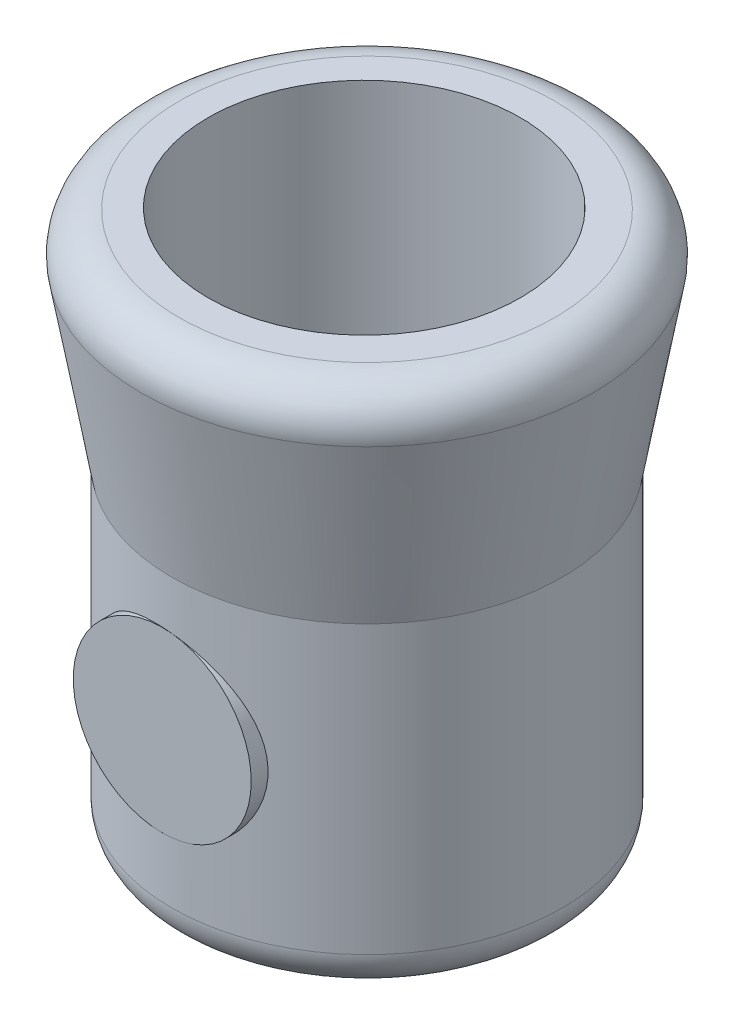
ISO-10303-21;
HEADER;
FILE_DESCRIPTION(('STEP AP214'),'2;1');
FILE_NAME('part.step','',(''),(''),'','','');
FILE_SCHEMA(('AUTOMOTIVE_DESIGN { 1 0 10303 214 1 1 1 1 }'));
ENDSEC;
DATA;
#1=APPLICATION_CONTEXT('core data for automotive mechanical design processes');
#2=APPLICATION_PROTOCOL_DEFINITION('international standard','automotive_design',2000,#1);
#3=PRODUCT_CONTEXT('',#1,'mechanical');
#4=PRODUCT('Part','Part','',(#3));
#5=PRODUCT_RELATED_PRODUCT_CATEGORY('part','',(#4));
#6=PRODUCT_DEFINITION_FORMATION('','',#4);
#7=PRODUCT_DEFINITION_CONTEXT('part definition',#1,'design');
#8=PRODUCT_DEFINITION('design','',#6,#7);
#9=PRODUCT_DEFINITION_SHAPE('','',#8);
#10=(LENGTH_UNIT() NAMED_UNIT(*) SI_UNIT(.MILLI.,.METRE.));
#11=(NAMED_UNIT(*) PLANE_ANGLE_UNIT() SI_UNIT($,.RADIAN.));
#12=(NAMED_UNIT(*) SI_UNIT($,.STERADIAN.) SOLID_ANGLE_UNIT());
#13=UNCERTAINTY_MEASURE_WITH_UNIT(LENGTH_MEASURE(1.E-05),#10,'distance_accuracy_value','');
#14=(GEOMETRIC_REPRESENTATION_CONTEXT(3) GLOBAL_UNCERTAINTY_ASSIGNED_CONTEXT((#13)) GLOBAL_UNIT_ASSIGNED_CONTEXT((#10,
#11,#12)) REPRESENTATION_CONTEXT('',''));
#15=CARTESIAN_POINT('',(0.,0.,0.));
#16=DIRECTION('',(0.,0.,1.));
#17=DIRECTION('',(1.,0.,0.));
#18=AXIS2_PLACEMENT_3D('',#15,#16,#17);
#19=CARTESIAN_POINT('',(30.,-70.,0.));
#20=DIRECTION('',(0.,-1.,0.));
#21=DIRECTION('',(0.,0.,-1.));
#22=AXIS2_PLACEMENT_3D('',#19,#20,#21);
#23=CYLINDRICAL_SURFACE('',#22,25.);
#24=CARTESIAN_POINT('',(30.,-65.,0.));
#25=DIRECTION('',(0.,-1.,0.));
#26=DIRECTION('',(0.,0.,-1.));
#27=AXIS2_PLACEMENT_3D('',#24,#25,#26);
#28=CIRCLE('',#27,25.);
#29=CARTESIAN_POINT('',(30.,-65.,-25.));
#30=VERTEX_POINT('',#29);
#31=EDGE_CURVE('E77',#30,#30,#28,.T.);
#32=ORIENTED_EDGE('',*,*,#31,.F.);
#33=EDGE_LOOP('',(#32));
#34=FACE_BOUND('',#33,.T.);
#35=CARTESIAN_POINT('',(30.,-28.3216783216779,0.));
#36=DIRECTION('',(0.,-1.,0.));
#37=DIRECTION('',(0.,0.,-1.));
#38=AXIS2_PLACEMENT_3D('',#35,#36,#37);
#39=CIRCLE('',#38,25.);
#40=CARTESIAN_POINT('',(30.,-28.3216783216779,-25.));
#41=VERTEX_POINT('',#40);
#42=EDGE_CURVE('E65',#41,#41,#39,.T.);
#43=ORIENTED_EDGE('',*,*,#42,.T.);
#44=EDGE_LOOP('',(#43));
#45=FACE_BOUND('',#44,.T.);
#46=CARTESIAN_POINT('',(30.,-57.2082714240676,25.));
#47=CARTESIAN_POINT('',(30.3039931747391,-57.1753347401536,24.9999980915506));
#48=CARTESIAN_POINT('',(30.6067343740086,-57.1301450727298,24.994440799908));
#49=CARTESIAN_POINT('',(31.2073587046698,-57.0156346864035,24.9726390266976));
#50=CARTESIAN_POINT('',(31.5052389175544,-56.9462999913821,24.9563883505092));
#51=CARTESIAN_POINT('',(32.094433406971,-56.78398062961,24.9138669076109));
#52=CARTESIAN_POINT('',(32.3857324536601,-56.6909462222746,24.8875750078757));
#53=CARTESIAN_POINT('',(32.9590879127817,-56.4821506928867,24.8259331690467));
#54=CARTESIAN_POINT('',(33.2411435988607,-56.3663877897773,24.7905825200223));
#55=CARTESIAN_POINT('',(33.7930791248408,-56.1136453907066,24.7121417666826));
#56=CARTESIAN_POINT('',(34.0630026593612,-55.9767515082594,24.6690827854199));
#57=CARTESIAN_POINT('',(34.5902732908694,-55.6824951690911,24.5764329021064));
#58=CARTESIAN_POINT('',(34.8476200079001,-55.5251320945023,24.5268418028816));
#59=CARTESIAN_POINT('',(35.3482130548631,-55.1911426895198,24.422570739774));
#60=CARTESIAN_POINT('',(35.5914659288213,-55.0145254107705,24.3678931688639));
#61=CARTESIAN_POINT('',(36.0628453361051,-54.6430370091775,24.2549104211854));
#62=CARTESIAN_POINT('',(36.2909662880447,-54.4481592142113,24.1966039210933));
#63=CARTESIAN_POINT('',(36.7424361080656,-54.0306302590207,24.074822053051));
#64=CARTESIAN_POINT('',(36.9649035421215,-53.8070575854434,24.0112360981742));
#65=CARTESIAN_POINT('',(37.390510954279,-53.3423175709296,23.8836704644446));
#66=CARTESIAN_POINT('',(37.5936504735084,-53.1011498125009,23.8196907762823));
#67=CARTESIAN_POINT('',(37.9795555068573,-52.6024037280023,23.6932049001939));
#68=CARTESIAN_POINT('',(38.1623079716916,-52.3448150551442,23.6306996759906));
#69=CARTESIAN_POINT('',(38.5060558849408,-51.814903241479,23.5091523214623));
#70=CARTESIAN_POINT('',(38.6670613952543,-51.542586997077,23.4501085967743));
#71=CARTESIAN_POINT('',(38.9713908454263,-50.9750934288494,23.3354130254141));
#72=CARTESIAN_POINT('',(39.1139226882085,-50.6794529058041,23.2799459997751));
#73=CARTESIAN_POINT('',(39.3733022918205,-50.0759551893137,23.1767274987231));
#74=CARTESIAN_POINT('',(39.490161391162,-49.7681034602264,23.1289726196758));
#75=CARTESIAN_POINT('',(39.6970688783428,-49.1423362338871,23.0429906759572));
#76=CARTESIAN_POINT('',(39.7871273340302,-48.8244245654991,23.0047600343212));
#77=CARTESIAN_POINT('',(39.9394637443664,-48.1809023654681,22.9393538916176));
#78=CARTESIAN_POINT('',(40.0017441271268,-47.855292509353,22.9121774243109));
#79=CARTESIAN_POINT('',(40.0945830693991,-47.2207927679872,22.8714184009345));
#80=CARTESIAN_POINT('',(40.126964950997,-46.9122188114786,22.85705661222));
#81=CARTESIAN_POINT('',(40.1664525498288,-46.2931435925758,22.8395210074064));
#82=CARTESIAN_POINT('',(40.1735593904048,-45.9826424164508,22.8363466940832));
#83=CARTESIAN_POINT('',(40.1624141242109,-45.3622501831445,22.8413084691835));
#84=CARTESIAN_POINT('',(40.1441668901026,-45.052359020189,22.8494423843405));
#85=CARTESIAN_POINT('',(40.0825388785543,-44.435582169358,22.876703022494));
#86=CARTESIAN_POINT('',(40.0391585098925,-44.1286964326831,22.8958295667007));
#87=CARTESIAN_POINT('',(39.9307106409369,-43.5363738320261,22.9430659153062));
#88=CARTESIAN_POINT('',(39.8669114510716,-43.2506609743966,22.9706471216081));
#89=CARTESIAN_POINT('',(39.7177954887776,-42.6857534155041,23.0341271316702));
#90=CARTESIAN_POINT('',(39.6324712952293,-42.4065609986217,23.0700288037078));
#91=CARTESIAN_POINT('',(39.4410523247752,-41.856451938195,23.1490224295194));
#92=CARTESIAN_POINT('',(39.3349576033423,-41.5855352725505,23.1921143640899));
#93=CARTESIAN_POINT('',(39.1028076799521,-41.0534283380378,23.2842109141497));
#94=CARTESIAN_POINT('',(38.9767510688279,-40.7922387574413,23.3332159470032));
#95=CARTESIAN_POINT('',(38.6982421632917,-40.2671581111182,23.4385134861796));
#96=CARTESIAN_POINT('',(38.5447352953291,-40.0038764158118,23.495056114184));
#97=CARTESIAN_POINT('',(38.2175302270084,-39.4909600128772,23.6114875348666));
#98=CARTESIAN_POINT('',(38.0438315058777,-39.2413256574748,23.671376413828));
#99=CARTESIAN_POINT('',(37.6772065093999,-38.7568906492857,23.7928097030807));
#100=CARTESIAN_POINT('',(37.4842736828425,-38.5220950954496,23.8543546721958));
#101=CARTESIAN_POINT('',(37.0802500782394,-38.0686133209701,23.9773779706211));
#102=CARTESIAN_POINT('',(36.8691568378452,-37.8499292923549,24.0388562897463));
#103=CARTESIAN_POINT('',(36.4144981062061,-37.4151486270408,24.1643050590765));
#104=CARTESIAN_POINT('',(36.1696936032888,-37.200308226947,24.2281480574557));
#105=CARTESIAN_POINT('',(35.6620613531019,-36.7919955839995,24.3517816941459));
#106=CARTESIAN_POINT('',(35.3992402635354,-36.5985155160835,24.4115738133185));
#107=CARTESIAN_POINT('',(34.8570354043864,-36.2342617994286,24.5252099942349));
#108=CARTESIAN_POINT('',(34.5776499841913,-36.0634904190961,24.5790534616679));
#109=CARTESIAN_POINT('',(34.0041404540026,-35.746123066004,24.6789699749004));
#110=CARTESIAN_POINT('',(33.7100170569708,-35.599525925265,24.7250433961124));
#111=CARTESIAN_POINT('',(33.1164476087592,-35.335156223562,24.8067588699927));
#112=CARTESIAN_POINT('',(32.8173086104501,-35.2167653453764,24.842628877147));
#113=CARTESIAN_POINT('',(32.2091257822793,-35.005444418165,24.9040791274669));
#114=CARTESIAN_POINT('',(31.9000820421167,-34.9125141386362,24.9296594637891));
#115=CARTESIAN_POINT('',(31.2746878816709,-34.753118122692,24.9694471010009));
#116=CARTESIAN_POINT('',(30.9583413350168,-34.6866386823718,24.9836602949543));
#117=CARTESIAN_POINT('',(30.3208446091971,-34.5807716993697,24.9999738598825));
#118=CARTESIAN_POINT('',(29.9996947654011,-34.541382274182,25.0020750726031));
#119=CARTESIAN_POINT('',(29.3800011833595,-34.4920101134423,24.9940830035242));
#120=CARTESIAN_POINT('',(29.0816040762496,-34.4800113296219,24.9849087568333));
#121=CARTESIAN_POINT('',(28.4853220289971,-34.4794334586249,24.9558576712503));
#122=CARTESIAN_POINT('',(28.1874370603293,-34.4908530218094,24.9359814491798));
#123=CARTESIAN_POINT('',(27.5943735697505,-34.5368587340619,24.8857696084367));
#124=CARTESIAN_POINT('',(27.2991949225943,-34.5714438055163,24.8554344763236));
#125=CARTESIAN_POINT('',(26.713600666865,-34.6632887374214,24.7848050813848));
#126=CARTESIAN_POINT('',(26.4231851312805,-34.7205489450019,24.7445106660976));
#127=CARTESIAN_POINT('',(25.8527024807172,-34.8561818401138,24.6552676854836));
#128=CARTESIAN_POINT('',(25.572550632621,-34.9342760241926,24.6064360156361));
#129=CARTESIAN_POINT('',(25.0204220213756,-35.1110829498773,24.5006697483099));
#130=CARTESIAN_POINT('',(24.7484451141367,-35.2097953278276,24.4437352937505));
#131=CARTESIAN_POINT('',(24.2141219165892,-35.4269450969569,24.3228011166232));
#132=CARTESIAN_POINT('',(23.9517756204931,-35.5453824762821,24.2588013983012));
#133=CARTESIAN_POINT('',(23.4378926923141,-35.8010914715344,24.1248687266473));
#134=CARTESIAN_POINT('',(23.1863602268392,-35.9383702632122,24.0549335166752));
#135=CARTESIAN_POINT('',(22.6770931494804,-36.2416438008211,23.9050332156802));
#136=CARTESIAN_POINT('',(22.4202824263988,-36.4090132593268,23.8247089371128));
#137=CARTESIAN_POINT('',(21.9216377639779,-36.7633046484117,23.6602838153705));
#138=CARTESIAN_POINT('',(21.6798106833593,-36.9502354293873,23.5761812726504));
#139=CARTESIAN_POINT('',(21.2122422687664,-37.3425895884394,23.4059232762909));
#140=CARTESIAN_POINT('',(20.9865078711639,-37.5480208554012,23.3197669585154));
#141=CARTESIAN_POINT('',(20.5522651097441,-37.9762695546814,23.1472438873671));
#142=CARTESIAN_POINT('',(20.343757282813,-38.1990875284564,23.060877127522));
#143=CARTESIAN_POINT('',(19.9286107809012,-38.6800708785589,22.8827933230597));
#144=CARTESIAN_POINT('',(19.7235293090968,-38.9396364494169,22.7912187560061));
#145=CARTESIAN_POINT('',(19.3360224593805,-39.4766833630245,22.6124994603795));
#146=CARTESIAN_POINT('',(19.1536012303308,-39.7541679724761,22.5253555447343));
#147=CARTESIAN_POINT('',(18.8128499657802,-40.3256139243829,22.3580793406246));
#148=CARTESIAN_POINT('',(18.6545213822744,-40.6195762584439,22.27794747488));
#149=CARTESIAN_POINT('',(18.3635414909454,-41.2221473326505,22.1273513744792));
#150=CARTESIAN_POINT('',(18.2308761266102,-41.5307479389707,22.0568818536629));
#151=CARTESIAN_POINT('',(17.9966432424786,-42.1501530224066,21.9302660867569));
#152=CARTESIAN_POINT('',(17.894182257869,-42.4605367545607,21.8737188486481));
#153=CARTESIAN_POINT('',(17.7159000293276,-43.0910023936261,21.7740979806972));
#154=CARTESIAN_POINT('',(17.6400782534469,-43.4110841067433,21.7310240818127));
#155=CARTESIAN_POINT('',(17.5162881190676,-44.0578797926339,21.6601486166104));
#156=CARTESIAN_POINT('',(17.4682872121724,-44.3845855505153,21.632329205713));
#157=CARTESIAN_POINT('',(17.4008144481347,-45.0418937467452,21.593102529719));
#158=CARTESIAN_POINT('',(17.3813385593792,-45.3724956277714,21.5816929453266));
#159=CARTESIAN_POINT('',(17.3718953815444,-45.9914811672551,21.5761663361083));
#160=CARTESIAN_POINT('',(17.3784405559974,-46.2798005734545,21.5800054928419));
#161=CARTESIAN_POINT('',(17.4133115153794,-46.8546464530338,21.6003631528056));
#162=CARTESIAN_POINT('',(17.4416351723238,-47.1411730988276,21.6168804172521));
#163=CARTESIAN_POINT('',(17.5196943533812,-47.7103564753856,21.6620403280206));
#164=CARTESIAN_POINT('',(17.5694332065846,-47.9930125974072,21.6906848595702));
#165=CARTESIAN_POINT('',(17.6897101128704,-48.5524717933608,21.7591714200877));
#166=CARTESIAN_POINT('',(17.7602488166585,-48.829274683889,21.7990137993688));
#167=CARTESIAN_POINT('',(17.9196250702762,-49.3694768128331,21.8877287009799));
#168=CARTESIAN_POINT('',(18.0080389157433,-49.6330361105025,21.9363898301547));
#169=CARTESIAN_POINT('',(18.2032297704104,-50.1516015290021,22.0419714680299));
#170=CARTESIAN_POINT('',(18.3100130718387,-50.4066046831454,22.0988948057995));
#171=CARTESIAN_POINT('',(18.6566124475927,-51.1568844921801,22.279937277432));
#172=CARTESIAN_POINT('',(18.9227703503893,-51.6377409613702,22.4143823758217));
#173=CARTESIAN_POINT('',(19.5536582784713,-52.6068402713765,22.715843186734));
#174=CARTESIAN_POINT('',(19.9262908721567,-53.0893268598283,22.8848296254905));
#175=CARTESIAN_POINT('',(20.5381201945218,-53.7632369456546,23.1413487500203));
#176=CARTESIAN_POINT('',(20.7510233206421,-53.9796876033014,23.227415342643));
#177=CARTESIAN_POINT('',(21.1936564478945,-54.3951392024021,23.3988155936098));
#178=CARTESIAN_POINT('',(21.4233888386022,-54.5941376569816,23.4841491459407));
#179=CARTESIAN_POINT('',(21.9202605792358,-54.9908582019017,23.6599545570955));
#180=CARTESIAN_POINT('',(22.1889007678114,-55.1868096449018,23.7501855266009));
#181=CARTESIAN_POINT('',(22.7433704508639,-55.5551098729456,23.9254219619079));
#182=CARTESIAN_POINT('',(23.0291934486757,-55.7274674988259,24.0104293784099));
#183=CARTESIAN_POINT('',(23.6166305482121,-56.0472684282405,24.1732398824356));
#184=CARTESIAN_POINT('',(23.9182525736305,-56.1946990703548,24.2510392997112));
#185=CARTESIAN_POINT('',(24.5352071645607,-56.4630221950302,24.3974694954286));
#186=CARTESIAN_POINT('',(24.8505381978348,-56.5839176343066,24.4661012950487));
#187=CARTESIAN_POINT('',(25.4796332796265,-56.7933971591236,24.5899339323617));
#188=CARTESIAN_POINT('',(25.7929416517309,-56.8830933541971,24.6455667792099));
#189=CARTESIAN_POINT('',(26.4278665122732,-57.0356041076418,24.7455677934203));
#190=CARTESIAN_POINT('',(26.7494841168775,-57.0984150344387,24.7899344386518));
#191=CARTESIAN_POINT('',(27.3974861506357,-57.1960739215723,24.866304279384));
#192=CARTESIAN_POINT('',(27.7238554369512,-57.230996617266,24.8983403981291));
#193=CARTESIAN_POINT('',(28.3792327431125,-57.2725186153905,24.9495690708364));
#194=CARTESIAN_POINT('',(28.7082388046399,-57.2791372813813,24.9687703978406));
#195=CARTESIAN_POINT('',(29.1978409439014,-57.2677699645232,24.9876469317721));
#196=CARTESIAN_POINT('',(29.3585766637843,-57.2606294782736,24.9922861119681));
#197=CARTESIAN_POINT('',(29.6796571844577,-57.2395477169657,24.9984630909637));
#198=CARTESIAN_POINT('',(29.840001999486,-57.2256066934345,25.0000010044571));
#199=CARTESIAN_POINT('',(30.,-57.2082714240676,25.));
#200=B_SPLINE_CURVE_WITH_KNOTS('',3,(#46,#47,#48,#49,#50,#51,#52,#53,#54,#55,#56,#57,#58,#59,
#60,#61,#62,#63,#64,#65,#66,#67,#68,#69,#70,#71,#72,#73,#74,#75,#76,#77,#78,#79,#80,#81,#82,#83,
#84,#85,#86,#87,#88,#89,#90,#91,#92,#93,#94,#95,#96,#97,#98,#99,#100,#101,#102,#103,#104,#105,
#106,#107,#108,#109,#110,#111,#112,#113,#114,#115,#116,#117,#118,#119,#120,#121,#122,#123,#124,
#125,#126,#127,#128,#129,#130,#131,#132,#133,#134,#135,#136,#137,#138,#139,#140,#141,#142,#143,
#144,#145,#146,#147,#148,#149,#150,#151,#152,#153,#154,#155,#156,#157,#158,#159,#160,#161,#162,
#163,#164,#165,#166,#167,#168,#169,#170,#171,#172,#173,#174,#175,#176,#177,#178,#179,#180,#181,
#182,#183,#184,#185,#186,#187,#188,#189,#190,#191,#192,#193,#194,#195,#196,#197,#198,#199),
.UNSPECIFIED.,.T.,.F.,(4,2,2,2,2,2,2,2,2,2,2,2,2,2,2,2,2,2,2,2,2,2,2,2,2,2,2,2,2,2,2,2,2,2,2,2,
2,2,2,2,2,2,2,2,2,2,2,2,2,2,2,2,2,2,2,2,2,2,2,2,2,2,2,2,2,2,2,2,2,2,2,2,2,2,2,2,4),(0.,
0.917153226558738,1.83483822337624,2.75446534369776,3.67416455688814,4.59023088414257,
5.50632486950684,6.42199002970338,7.33799107482571,8.30215041647162,9.26633264292401,
10.231128521475,11.1954764670817,12.1927738140852,13.1896298096359,14.1861108552222,
15.1825047802405,16.1130953591524,17.0436445777089,17.9740149838121,18.9043702583174,
19.7855215962438,20.6669771426005,21.5484303348449,22.4299457791497,23.3588420610598,
24.2877623056551,25.2170000320974,26.1463639519313,27.1408831287944,28.1350367598404,
29.1292896239695,30.1234944366536,31.0933361801017,32.0631691429692,33.032498989147,
34.0017614690462,34.8970016487337,35.792190235668,36.6873371830965,37.58249783471,
38.4662447529539,39.3499760853347,40.2337068866363,41.1177751955492,42.067419806536,
43.0174959512829,43.96797915858,44.918491977636,45.9469975960913,46.9756912468751,
48.004446869562,49.0326374065936,50.0263571344859,51.020057018019,52.0125919858757,
53.0049866592299,53.8691586946012,54.7332463020879,55.5974682844811,56.4617173061959,
57.3074792983979,58.1535315748001,59.8446643864999,61.7342701973617,62.6802324267582,
63.6263292339947,64.6586870330201,65.6906569322332,66.7231494460028,67.7555268546485,
68.746010492723,69.7366278799062,70.7245816006235,71.7118593269746,72.1945942101023,
72.677311239984),.UNSPECIFIED.);
#201=CARTESIAN_POINT('',(30.,-57.2082714240676,25.));
#202=VERTEX_POINT('',#201);
#203=CARTESIAN_POINT('',(30.,-34.5460218423109,25.));
#204=VERTEX_POINT('',#203);
#205=EDGE_CURVE('E11',#202,#204,#200,.T.);
#206=ORIENTED_EDGE('',*,*,#205,.F.);
#207=EDGE_CURVE('E43',#204,#202,#200,.T.);
#208=ORIENTED_EDGE('',*,*,#207,.F.);
#209=EDGE_LOOP('',(#206,#208));
#210=FACE_BOUND('',#209,.T.);
#211=ADVANCED_FACE('F39',(#34,#45,#210),#23,.T.);
#212=CARTESIAN_POINT('',(30.,-5.86927344658478,0.));
#213=DIRECTION('',(0.,1.,0.));
#214=DIRECTION('',(0.,0.,1.));
#215=AXIS2_PLACEMENT_3D('',#212,#213,#214);
#216=CONICAL_SURFACE('',#215,28.9638196260967,0.17474262650302);
#217=ORIENTED_EDGE('',*,*,#42,.F.);
#218=EDGE_LOOP('',(#217));
#219=FACE_BOUND('',#218,.T.);
#220=CARTESIAN_POINT('',(30.,-5.86927344658478,0.));
#221=DIRECTION('',(0.,-1.,0.));
#222=DIRECTION('',(0.,0.,-1.));
#223=AXIS2_PLACEMENT_3D('',#220,#221,#222);
#224=CIRCLE('',#223,28.9638196260967);
#225=CARTESIAN_POINT('',(30.,-5.86927344658478,-28.9638196260967));
#226=VERTEX_POINT('',#225);
#227=EDGE_CURVE('E87',#226,#226,#224,.T.);
#228=ORIENTED_EDGE('',*,*,#227,.T.);
#229=EDGE_LOOP('',(#228));
#230=FACE_BOUND('',#229,.T.);
#231=ADVANCED_FACE('F93',(#219,#230),#216,.T.);
#232=CARTESIAN_POINT('',(30.,-5.,0.));
#233=DIRECTION('',(0.,-1.,0.));
#234=DIRECTION('',(0.,0.,-1.));
#235=AXIS2_PLACEMENT_3D('',#232,#233,#234);
#236=TOROIDAL_SURFACE('',#235,24.0399630405469,5.);
#237=ORIENTED_EDGE('',*,*,#227,.F.);
#238=EDGE_LOOP('',(#237));
#239=FACE_BOUND('',#238,.T.);
#240=CARTESIAN_POINT('',(30.,0.,0.));
#241=DIRECTION('',(0.,-1.,0.));
#242=DIRECTION('',(0.,0.,-1.));
#243=AXIS2_PLACEMENT_3D('',#240,#241,#242);
#244=CIRCLE('',#243,24.0399630405469);
#245=CARTESIAN_POINT('',(30.,0.,-24.0399630405469));
#246=VERTEX_POINT('',#245);
#247=EDGE_CURVE('E84',#246,#246,#244,.T.);
#248=ORIENTED_EDGE('',*,*,#247,.T.);
#249=EDGE_LOOP('',(#248));
#250=FACE_BOUND('',#249,.T.);
#251=ADVANCED_FACE('F96',(#239,#250),#236,.T.);
#252=CARTESIAN_POINT('',(30.,0.,0.));
#253=DIRECTION('',(0.,-1.,0.));
#254=DIRECTION('',(0.,0.,-1.));
#255=AXIS2_PLACEMENT_3D('',#252,#253,#254);
#256=PLANE('',#255);
#257=CARTESIAN_POINT('',(29.6446884856981,0.,0.));
#258=DIRECTION('',(0.,1.,0.));
#259=DIRECTION('',(0.,0.,1.));
#260=AXIS2_PLACEMENT_3D('',#257,#258,#259);
#261=CIRCLE('',#260,20.);
#262=CARTESIAN_POINT('',(29.6446884856981,0.,20.));
#263=VERTEX_POINT('',#262);
#264=EDGE_CURVE('E71',#263,#263,#261,.T.);
#265=ORIENTED_EDGE('',*,*,#264,.F.);
#266=EDGE_LOOP('',(#265));
#267=FACE_BOUND('',#266,.T.);
#268=ORIENTED_EDGE('',*,*,#247,.F.);
#269=EDGE_LOOP('',(#268));
#270=FACE_BOUND('',#269,.T.);
#271=ADVANCED_FACE('F101',(#267,#270),#256,.F.);
#272=CARTESIAN_POINT('',(10.,-70.,0.));
#273=DIRECTION('',(0.,1.,0.));
#274=DIRECTION('',(0.,0.,1.));
#275=AXIS2_PLACEMENT_3D('',#272,#273,#274);
#276=PLANE('',#275);
#277=CARTESIAN_POINT('',(30.,-70.,0.));
#278=DIRECTION('',(0.,-1.,0.));
#279=DIRECTION('',(0.,0.,-1.));
#280=AXIS2_PLACEMENT_3D('',#277,#278,#279);
#281=CIRCLE('',#280,20.);
#282=CARTESIAN_POINT('',(30.,-70.,-20.));
#283=VERTEX_POINT('',#282);
#284=EDGE_CURVE('E81',#283,#283,#281,.T.);
#285=ORIENTED_EDGE('',*,*,#284,.T.);
#286=EDGE_LOOP('',(#285));
#287=FACE_BOUND('',#286,.T.);
#288=ADVANCED_FACE('F106',(#287),#276,.F.);
#289=CARTESIAN_POINT('',(30.,-65.,0.));
#290=DIRECTION('',(0.,-1.,0.));
#291=DIRECTION('',(0.,0.,-1.));
#292=AXIS2_PLACEMENT_3D('',#289,#290,#291);
#293=TOROIDAL_SURFACE('',#292,20.,5.);
#294=ORIENTED_EDGE('',*,*,#284,.F.);
#295=EDGE_LOOP('',(#294));
#296=FACE_BOUND('',#295,.T.);
#297=ORIENTED_EDGE('',*,*,#31,.T.);
#298=EDGE_LOOP('',(#297));
#299=FACE_BOUND('',#298,.T.);
#300=ADVANCED_FACE('F114',(#296,#299),#293,.T.);
#301=CARTESIAN_POINT('',(29.6446884856981,-29.,0.));
#302=DIRECTION('',(0.,1.,0.));
#303=DIRECTION('',(0.,0.,1.));
#304=AXIS2_PLACEMENT_3D('',#301,#302,#303);
#305=CYLINDRICAL_SURFACE('',#304,20.);
#306=CARTESIAN_POINT('',(29.6446884856981,-29.,0.));
#307=DIRECTION('',(0.,1.,0.));
#308=DIRECTION('',(0.,0.,1.));
#309=AXIS2_PLACEMENT_3D('',#306,#307,#308);
#310=CIRCLE('',#309,20.);
#311=CARTESIAN_POINT('',(29.6446884856981,-29.,20.));
#312=VERTEX_POINT('',#311);
#313=EDGE_CURVE('E73',#312,#312,#310,.T.);
#314=ORIENTED_EDGE('',*,*,#313,.F.);
#315=EDGE_LOOP('',(#314));
#316=FACE_BOUND('',#315,.T.);
#317=ORIENTED_EDGE('',*,*,#264,.T.);
#318=EDGE_LOOP('',(#317));
#319=FACE_BOUND('',#318,.T.);
#320=ADVANCED_FACE('F126',(#316,#319),#305,.F.);
#321=CARTESIAN_POINT('',(29.6446884856981,-29.,0.));
#322=DIRECTION('',(0.,1.,0.));
#323=DIRECTION('',(0.,0.,1.));
#324=AXIS2_PLACEMENT_3D('',#321,#322,#323);
#325=PLANE('',#324);
#326=ORIENTED_EDGE('',*,*,#313,.T.);
#327=EDGE_LOOP('',(#326));
#328=FACE_BOUND('',#327,.T.);
#329=ADVANCED_FACE('F131',(#328),#325,.T.);
#330=CARTESIAN_POINT('',(28.7723955243382,-45.8771466331893,25.));
#331=DIRECTION('',(0.,0.,-1.));
#332=DIRECTION('',(-1.,0.,0.));
#333=AXIS2_PLACEMENT_3D('',#330,#331,#332);
#334=CYLINDRICAL_SURFACE('',#333,11.3974296126417);
#335=CARTESIAN_POINT('',(28.7723955243382,-45.8771466331893,25.));
#336=DIRECTION('',(0.,0.,1.));
#337=DIRECTION('',(1.,0.,0.));
#338=AXIS2_PLACEMENT_3D('',#335,#336,#337);
#339=CIRCLE('',#338,11.3974296126417);
#340=EDGE_CURVE('E66',#202,#204,#339,.T.);
#341=ORIENTED_EDGE('',*,*,#340,.F.);
#342=ORIENTED_EDGE('',*,*,#205,.T.);
#343=EDGE_LOOP('',(#341,#342));
#344=FACE_BOUND('',#343,.T.);
#345=ADVANCED_FACE('F67',(#344),#334,.T.);
#346=EDGE_CURVE('E64',#204,#202,#339,.T.);
#347=ORIENTED_EDGE('',*,*,#346,.F.);
#348=ORIENTED_EDGE('',*,*,#207,.T.);
#349=EDGE_LOOP('',(#347,#348));
#350=FACE_BOUND('',#349,.T.);
#351=ADVANCED_FACE('F62',(#350),#334,.T.);
#352=CARTESIAN_POINT('',(28.7723955243382,-45.8771466331893,25.));
#353=DIRECTION('',(0.,0.,1.));
#354=DIRECTION('',(1.,0.,0.));
#355=AXIS2_PLACEMENT_3D('',#352,#353,#354);
#356=PLANE('',#355);
#357=ORIENTED_EDGE('',*,*,#346,.T.);
#358=ORIENTED_EDGE('',*,*,#340,.T.);
#359=EDGE_LOOP('',(#357,#358));
#360=FACE_BOUND('',#359,.T.);
#361=ADVANCED_FACE('F70',(#360),#356,.T.);
#362=CLOSED_SHELL('',(#211,#231,#251,#271,#288,#300,#320,#329,#345,#351,#361));
#363=MANIFOLD_SOLID_BREP('B2',#362);
#364=ADVANCED_BREP_SHAPE_REPRESENTATION('',(#18,#363),#14);
#365=SHAPE_DEFINITION_REPRESENTATION(#9,#364);
ENDSEC;
END-ISO-10303-21;
